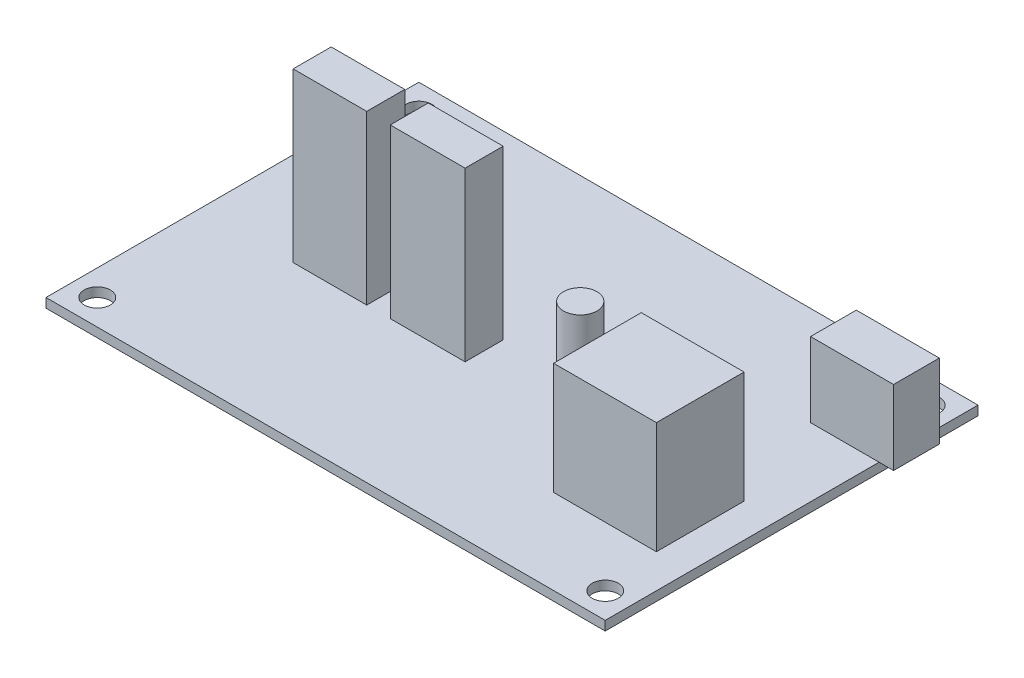
ISO-10303-21;
HEADER;
FILE_DESCRIPTION(('STEP AP214'),'2;1');
FILE_NAME('part.step','',(''),(''),'','','');
FILE_SCHEMA(('AUTOMOTIVE_DESIGN { 1 0 10303 214 1 1 1 1 }'));
ENDSEC;
DATA;
#1=APPLICATION_CONTEXT('core data for automotive mechanical design processes');
#2=APPLICATION_PROTOCOL_DEFINITION('international standard','automotive_design',2000,#1);
#3=PRODUCT_CONTEXT('',#1,'mechanical');
#4=PRODUCT('Part','Part','',(#3));
#5=PRODUCT_RELATED_PRODUCT_CATEGORY('part','',(#4));
#6=PRODUCT_DEFINITION_FORMATION('','',#4);
#7=PRODUCT_DEFINITION_CONTEXT('part definition',#1,'design');
#8=PRODUCT_DEFINITION('design','',#6,#7);
#9=PRODUCT_DEFINITION_SHAPE('','',#8);
#10=(LENGTH_UNIT() NAMED_UNIT(*) SI_UNIT(.MILLI.,.METRE.));
#11=(NAMED_UNIT(*) PLANE_ANGLE_UNIT() SI_UNIT($,.RADIAN.));
#12=(NAMED_UNIT(*) SI_UNIT($,.STERADIAN.) SOLID_ANGLE_UNIT());
#13=UNCERTAINTY_MEASURE_WITH_UNIT(LENGTH_MEASURE(1.E-05),#10,'distance_accuracy_value','');
#14=(GEOMETRIC_REPRESENTATION_CONTEXT(3) GLOBAL_UNCERTAINTY_ASSIGNED_CONTEXT((#13)) GLOBAL_UNIT_ASSIGNED_CONTEXT((#10,
#11,#12)) REPRESENTATION_CONTEXT('',''));
#15=CARTESIAN_POINT('',(0.,0.,0.));
#16=DIRECTION('',(0.,0.,1.));
#17=DIRECTION('',(1.,0.,0.));
#18=AXIS2_PLACEMENT_3D('',#15,#16,#17);
#19=CARTESIAN_POINT('',(0.,1.,0.));
#20=DIRECTION('',(0.,-1.,0.));
#21=DIRECTION('',(0.,0.,-1.));
#22=AXIS2_PLACEMENT_3D('',#19,#20,#21);
#23=PLANE('',#22);
#24=DIRECTION('',(0.,0.,1.));
#25=VECTOR('',#24,1.);
#26=CARTESIAN_POINT('',(10.0167713371704,1.,-20.580137030727));
#27=LINE('',#26,#25);
#28=CARTESIAN_POINT('',(10.0167713371704,1.,-20.580137030727));
#29=VERTEX_POINT('',#28);
#30=CARTESIAN_POINT('',(10.0167713371704,1.,-16.5015168848841));
#31=VERTEX_POINT('',#30);
#32=EDGE_CURVE('E197',#29,#31,#27,.T.);
#33=ORIENTED_EDGE('',*,*,#32,.F.);
#34=DIRECTION('',(-1.,0.,0.));
#35=VECTOR('',#34,1.);
#36=CARTESIAN_POINT('',(10.0167713371704,1.,-20.580137030727));
#37=LINE('',#36,#35);
#38=CARTESIAN_POINT('',(17.91299341658,1.,-20.580137030727));
#39=VERTEX_POINT('',#38);
#40=EDGE_CURVE('E210',#39,#29,#37,.T.);
#41=ORIENTED_EDGE('',*,*,#40,.F.);
#42=DIRECTION('',(0.,0.,-1.));
#43=VECTOR('',#42,1.);
#44=CARTESIAN_POINT('',(17.91299341658,1.,-20.580137030727));
#45=LINE('',#44,#43);
#46=CARTESIAN_POINT('',(17.91299341658,1.,-16.5015168848841));
#47=VERTEX_POINT('',#46);
#48=EDGE_CURVE('E219',#47,#39,#45,.T.);
#49=ORIENTED_EDGE('',*,*,#48,.F.);
#50=DIRECTION('',(1.,0.,0.));
#51=VECTOR('',#50,1.);
#52=CARTESIAN_POINT('',(10.0167713371704,1.,-16.5015168848841));
#53=LINE('',#52,#51);
#54=EDGE_CURVE('E200',#31,#47,#53,.T.);
#55=ORIENTED_EDGE('',*,*,#54,.F.);
#56=EDGE_LOOP('',(#33,#41,#49,#55));
#57=FACE_BOUND('',#56,.T.);
#58=DIRECTION('',(0.,0.,1.));
#59=VECTOR('',#58,1.);
#60=CARTESIAN_POINT('',(45.346373352384,1.,-9.11745080098569));
#61=LINE('',#60,#59);
#62=CARTESIAN_POINT('',(45.346373352384,1.,-18.5237104188332));
#63=VERTEX_POINT('',#62);
#64=CARTESIAN_POINT('',(45.346373352384,1.,-9.11745080098569));
#65=VERTEX_POINT('',#64);
#66=EDGE_CURVE('E273',#63,#65,#61,.T.);
#67=ORIENTED_EDGE('',*,*,#66,.F.);
#68=DIRECTION('',(-1.,0.,0.));
#69=VECTOR('',#68,1.);
#70=CARTESIAN_POINT('',(45.346373352384,1.,-18.5237104188332));
#71=LINE('',#70,#69);
#72=CARTESIAN_POINT('',(56.3756946500877,1.,-18.5237104188332));
#73=VERTEX_POINT('',#72);
#74=EDGE_CURVE('E278',#73,#63,#71,.T.);
#75=ORIENTED_EDGE('',*,*,#74,.F.);
#76=DIRECTION('',(0.,0.,-1.));
#77=VECTOR('',#76,1.);
#78=CARTESIAN_POINT('',(56.3756946500877,1.,-9.11745080098569));
#79=LINE('',#78,#77);
#80=CARTESIAN_POINT('',(56.3756946500877,1.,-9.11745080098569));
#81=VERTEX_POINT('',#80);
#82=EDGE_CURVE('E290',#81,#73,#79,.T.);
#83=ORIENTED_EDGE('',*,*,#82,.F.);
#84=DIRECTION('',(1.,0.,0.));
#85=VECTOR('',#84,1.);
#86=CARTESIAN_POINT('',(45.346373352384,1.,-9.11745080098569));
#87=LINE('',#86,#85);
#88=EDGE_CURVE('E287',#65,#81,#87,.T.);
#89=ORIENTED_EDGE('',*,*,#88,.F.);
#90=EDGE_LOOP('',(#67,#75,#83,#89));
#91=FACE_BOUND('',#90,.T.);
#92=CARTESIAN_POINT('',(2.75,1.,-2.75000000000001));
#93=DIRECTION('',(0.,1.,0.));
#94=DIRECTION('',(0.,0.,1.));
#95=AXIS2_PLACEMENT_3D('',#92,#93,#94);
#96=CIRCLE('',#95,1.4);
#97=CARTESIAN_POINT('',(2.75,1.,-1.35000000000001));
#98=VERTEX_POINT('',#97);
#99=EDGE_CURVE('E306',#98,#98,#96,.T.);
#100=ORIENTED_EDGE('',*,*,#99,.F.);
#101=EDGE_LOOP('',(#100));
#102=FACE_BOUND('',#101,.T.);
#103=CARTESIAN_POINT('',(57.25,1.,-2.75000000000001));
#104=DIRECTION('',(0.,1.,0.));
#105=DIRECTION('',(0.,0.,1.));
#106=AXIS2_PLACEMENT_3D('',#103,#104,#105);
#107=CIRCLE('',#106,1.4);
#108=CARTESIAN_POINT('',(57.25,1.,-1.35000000000001));
#109=VERTEX_POINT('',#108);
#110=EDGE_CURVE('E317',#109,#109,#107,.T.);
#111=ORIENTED_EDGE('',*,*,#110,.F.);
#112=EDGE_LOOP('',(#111));
#113=FACE_BOUND('',#112,.T.);
#114=CARTESIAN_POINT('',(57.25,1.,-37.25));
#115=DIRECTION('',(0.,1.,0.));
#116=DIRECTION('',(0.,0.,1.));
#117=AXIS2_PLACEMENT_3D('',#114,#115,#116);
#118=CIRCLE('',#117,1.4);
#119=CARTESIAN_POINT('',(57.25,1.,-35.85));
#120=VERTEX_POINT('',#119);
#121=EDGE_CURVE('E311',#120,#120,#118,.T.);
#122=ORIENTED_EDGE('',*,*,#121,.F.);
#123=EDGE_LOOP('',(#122));
#124=FACE_BOUND('',#123,.T.);
#125=CARTESIAN_POINT('',(2.75,1.,-37.25));
#126=DIRECTION('',(0.,1.,0.));
#127=DIRECTION('',(0.,0.,1.));
#128=AXIS2_PLACEMENT_3D('',#125,#126,#127);
#129=CIRCLE('',#128,1.4);
#130=CARTESIAN_POINT('',(2.75,1.,-35.85));
#131=VERTEX_POINT('',#130);
#132=EDGE_CURVE('E310',#131,#131,#129,.T.);
#133=ORIENTED_EDGE('',*,*,#132,.F.);
#134=EDGE_LOOP('',(#133));
#135=FACE_BOUND('',#134,.T.);
#136=CARTESIAN_POINT('',(41.0167064095504,1.,-16.3046792013688));
#137=DIRECTION('',(0.,-1.,0.));
#138=DIRECTION('',(0.,0.,-1.));
#139=AXIS2_PLACEMENT_3D('',#136,#137,#138);
#140=CIRCLE('',#139,1.79471379581626);
#141=CARTESIAN_POINT('',(41.0167064095504,1.,-18.0993929971851));
#142=VERTEX_POINT('',#141);
#143=EDGE_CURVE('E11',#142,#142,#140,.F.);
#144=ORIENTED_EDGE('',*,*,#143,.F.);
#145=EDGE_LOOP('',(#144));
#146=FACE_BOUND('',#145,.T.);
#147=DIRECTION('',(-1.,0.,0.));
#148=VECTOR('',#147,1.);
#149=CARTESIAN_POINT('',(61.5539774171623,1.,-34.2942300538169));
#150=LINE('',#149,#148);
#151=CARTESIAN_POINT('',(60.,1.,-34.2942300538169));
#152=VERTEX_POINT('',#151);
#153=CARTESIAN_POINT('',(52.6468308758439,1.,-34.2942300538169));
#154=VERTEX_POINT('',#153);
#155=EDGE_CURVE('E249',#152,#154,#150,.T.);
#156=ORIENTED_EDGE('',*,*,#155,.F.);
#157=DIRECTION('',(0.,0.,-1.));
#158=VECTOR('',#157,1.);
#159=CARTESIAN_POINT('',(60.,1.,0.));
#160=LINE('',#159,#158);
#161=CARTESIAN_POINT('',(60.,1.,-40.));
#162=VERTEX_POINT('',#161);
#163=EDGE_CURVE('E337',#152,#162,#160,.T.);
#164=ORIENTED_EDGE('',*,*,#163,.T.);
#165=DIRECTION('',(-1.,0.,0.));
#166=VECTOR('',#165,1.);
#167=CARTESIAN_POINT('',(0.,1.,-40.));
#168=LINE('',#167,#166);
#169=CARTESIAN_POINT('',(0.,1.,-40.));
#170=VERTEX_POINT('',#169);
#171=EDGE_CURVE('E341',#162,#170,#168,.T.);
#172=ORIENTED_EDGE('',*,*,#171,.T.);
#173=DIRECTION('',(0.,0.,1.));
#174=VECTOR('',#173,1.);
#175=CARTESIAN_POINT('',(0.,1.,0.));
#176=LINE('',#175,#174);
#177=CARTESIAN_POINT('',(0.,1.,0.));
#178=VERTEX_POINT('',#177);
#179=EDGE_CURVE('E331',#170,#178,#176,.T.);
#180=ORIENTED_EDGE('',*,*,#179,.T.);
#181=DIRECTION('',(1.,0.,0.));
#182=VECTOR('',#181,1.);
#183=CARTESIAN_POINT('',(0.,1.,0.));
#184=LINE('',#183,#182);
#185=CARTESIAN_POINT('',(60.,1.,0.));
#186=VERTEX_POINT('',#185);
#187=EDGE_CURVE('E334',#178,#186,#184,.T.);
#188=ORIENTED_EDGE('',*,*,#187,.T.);
#189=CARTESIAN_POINT('',(60.,1.,-29.385358713867));
#190=VERTEX_POINT('',#189);
#191=EDGE_CURVE('E338',#186,#190,#160,.T.);
#192=ORIENTED_EDGE('',*,*,#191,.T.);
#193=DIRECTION('',(1.,0.,0.));
#194=VECTOR('',#193,1.);
#195=CARTESIAN_POINT('',(61.5539774171623,1.,-29.385358713867));
#196=LINE('',#195,#194);
#197=CARTESIAN_POINT('',(52.6468308758439,1.,-29.385358713867));
#198=VERTEX_POINT('',#197);
#199=EDGE_CURVE('E240',#198,#190,#196,.T.);
#200=ORIENTED_EDGE('',*,*,#199,.F.);
#201=DIRECTION('',(0.,0.,1.));
#202=VECTOR('',#201,1.);
#203=CARTESIAN_POINT('',(52.6468308758439,1.,-34.2942300538169));
#204=LINE('',#203,#202);
#205=EDGE_CURVE('E253',#154,#198,#204,.T.);
#206=ORIENTED_EDGE('',*,*,#205,.F.);
#207=EDGE_LOOP('',(#156,#164,#172,#180,#188,#192,#200,#206));
#208=FACE_BOUND('',#207,.T.);
#209=DIRECTION('',(0.,0.,1.));
#210=VECTOR('',#209,1.);
#211=CARTESIAN_POINT('',(20.435832094698,1.,-20.580137030727));
#212=LINE('',#211,#210);
#213=CARTESIAN_POINT('',(20.435832094698,1.,-20.580137030727));
#214=VERTEX_POINT('',#213);
#215=CARTESIAN_POINT('',(20.435832094698,1.,-16.5015168848841));
#216=VERTEX_POINT('',#215);
#217=EDGE_CURVE('E196',#214,#216,#212,.T.);
#218=ORIENTED_EDGE('',*,*,#217,.F.);
#219=DIRECTION('',(-1.,0.,0.));
#220=VECTOR('',#219,1.);
#221=CARTESIAN_POINT('',(20.435832094698,1.,-20.580137030727));
#222=LINE('',#221,#220);
#223=CARTESIAN_POINT('',(28.4665301577007,1.,-20.580137030727));
#224=VERTEX_POINT('',#223);
#225=EDGE_CURVE('E193',#224,#214,#222,.T.);
#226=ORIENTED_EDGE('',*,*,#225,.F.);
#227=DIRECTION('',(0.,0.,-1.));
#228=VECTOR('',#227,1.);
#229=CARTESIAN_POINT('',(28.4665301577007,1.,-20.580137030727));
#230=LINE('',#229,#228);
#231=CARTESIAN_POINT('',(28.4665301577007,1.,-16.5015168848841));
#232=VERTEX_POINT('',#231);
#233=EDGE_CURVE('E53',#232,#224,#230,.T.);
#234=ORIENTED_EDGE('',*,*,#233,.F.);
#235=DIRECTION('',(1.,0.,0.));
#236=VECTOR('',#235,1.);
#237=CARTESIAN_POINT('',(20.435832094698,1.,-16.5015168848841));
#238=LINE('',#237,#236);
#239=EDGE_CURVE('E48',#216,#232,#238,.T.);
#240=ORIENTED_EDGE('',*,*,#239,.F.);
#241=EDGE_LOOP('',(#218,#226,#234,#240));
#242=FACE_BOUND('',#241,.T.);
#243=ADVANCED_FACE('F33',(#57,#91,#102,#113,#124,#135,#146,#208,#242),#23,.F.);
#244=CARTESIAN_POINT('',(0.,1.,0.));
#245=DIRECTION('',(1.,0.,0.));
#246=DIRECTION('',(0.,0.,-1.));
#247=AXIS2_PLACEMENT_3D('',#244,#245,#246);
#248=PLANE('',#247);
#249=DIRECTION('',(0.,0.,1.));
#250=VECTOR('',#249,1.);
#251=CARTESIAN_POINT('',(0.,0.,0.));
#252=LINE('',#251,#250);
#253=CARTESIAN_POINT('',(0.,0.,-40.));
#254=VERTEX_POINT('',#253);
#255=CARTESIAN_POINT('',(0.,0.,0.));
#256=VERTEX_POINT('',#255);
#257=EDGE_CURVE('E328',#254,#256,#252,.T.);
#258=ORIENTED_EDGE('',*,*,#257,.T.);
#259=DIRECTION('',(0.,-1.,0.));
#260=VECTOR('',#259,1.);
#261=CARTESIAN_POINT('',(0.,1.,0.));
#262=LINE('',#261,#260);
#263=EDGE_CURVE('E41',#178,#256,#262,.T.);
#264=ORIENTED_EDGE('',*,*,#263,.F.);
#265=ORIENTED_EDGE('',*,*,#179,.F.);
#266=DIRECTION('',(0.,-1.,0.));
#267=VECTOR('',#266,1.);
#268=CARTESIAN_POINT('',(0.,1.,-40.));
#269=LINE('',#268,#267);
#270=EDGE_CURVE('E344',#170,#254,#269,.T.);
#271=ORIENTED_EDGE('',*,*,#270,.T.);
#272=EDGE_LOOP('',(#258,#264,#265,#271));
#273=FACE_BOUND('',#272,.T.);
#274=ADVANCED_FACE('F35',(#273),#248,.F.);
#275=CARTESIAN_POINT('',(0.,1.,0.));
#276=DIRECTION('',(0.,0.,-1.));
#277=DIRECTION('',(-1.,0.,0.));
#278=AXIS2_PLACEMENT_3D('',#275,#276,#277);
#279=PLANE('',#278);
#280=DIRECTION('',(1.,0.,0.));
#281=VECTOR('',#280,1.);
#282=CARTESIAN_POINT('',(0.,0.,0.));
#283=LINE('',#282,#281);
#284=CARTESIAN_POINT('',(60.,0.,0.));
#285=VERTEX_POINT('',#284);
#286=EDGE_CURVE('E347',#256,#285,#283,.T.);
#287=ORIENTED_EDGE('',*,*,#286,.T.);
#288=DIRECTION('',(0.,-1.,0.));
#289=VECTOR('',#288,1.);
#290=CARTESIAN_POINT('',(60.,1.,0.));
#291=LINE('',#290,#289);
#292=EDGE_CURVE('E357',#186,#285,#291,.T.);
#293=ORIENTED_EDGE('',*,*,#292,.F.);
#294=ORIENTED_EDGE('',*,*,#187,.F.);
#295=ORIENTED_EDGE('',*,*,#263,.T.);
#296=EDGE_LOOP('',(#287,#293,#294,#295));
#297=FACE_BOUND('',#296,.T.);
#298=ADVANCED_FACE('F362',(#297),#279,.F.);
#299=CARTESIAN_POINT('',(60.,1.,0.));
#300=DIRECTION('',(-1.,0.,0.));
#301=DIRECTION('',(0.,0.,1.));
#302=AXIS2_PLACEMENT_3D('',#299,#300,#301);
#303=PLANE('',#302);
#304=DIRECTION('',(0.,0.,-1.));
#305=VECTOR('',#304,1.);
#306=CARTESIAN_POINT('',(60.,0.,0.));
#307=LINE('',#306,#305);
#308=CARTESIAN_POINT('',(60.,0.,-40.));
#309=VERTEX_POINT('',#308);
#310=EDGE_CURVE('E349',#285,#309,#307,.T.);
#311=ORIENTED_EDGE('',*,*,#310,.T.);
#312=DIRECTION('',(0.,-1.,0.));
#313=VECTOR('',#312,1.);
#314=CARTESIAN_POINT('',(60.,1.,-40.));
#315=LINE('',#314,#313);
#316=EDGE_CURVE('E354',#162,#309,#315,.T.);
#317=ORIENTED_EDGE('',*,*,#316,.F.);
#318=ORIENTED_EDGE('',*,*,#163,.F.);
#319=EDGE_CURVE('E342',#190,#152,#160,.T.);
#320=ORIENTED_EDGE('',*,*,#319,.F.);
#321=ORIENTED_EDGE('',*,*,#191,.F.);
#322=ORIENTED_EDGE('',*,*,#292,.T.);
#323=EDGE_LOOP('',(#311,#317,#318,#320,#321,#322));
#324=FACE_BOUND('',#323,.T.);
#325=ADVANCED_FACE('F374',(#324),#303,.F.);
#326=CARTESIAN_POINT('',(0.,1.,-40.));
#327=DIRECTION('',(0.,0.,1.));
#328=DIRECTION('',(1.,0.,0.));
#329=AXIS2_PLACEMENT_3D('',#326,#327,#328);
#330=PLANE('',#329);
#331=DIRECTION('',(-1.,0.,0.));
#332=VECTOR('',#331,1.);
#333=CARTESIAN_POINT('',(0.,0.,-40.));
#334=LINE('',#333,#332);
#335=EDGE_CURVE('E335',#309,#254,#334,.T.);
#336=ORIENTED_EDGE('',*,*,#335,.T.);
#337=ORIENTED_EDGE('',*,*,#270,.F.);
#338=ORIENTED_EDGE('',*,*,#171,.F.);
#339=ORIENTED_EDGE('',*,*,#316,.T.);
#340=EDGE_LOOP('',(#336,#337,#338,#339));
#341=FACE_BOUND('',#340,.T.);
#342=ADVANCED_FACE('F378',(#341),#330,.F.);
#343=CARTESIAN_POINT('',(0.,0.,0.));
#344=DIRECTION('',(0.,-1.,0.));
#345=DIRECTION('',(0.,0.,-1.));
#346=AXIS2_PLACEMENT_3D('',#343,#344,#345);
#347=PLANE('',#346);
#348=CARTESIAN_POINT('',(2.75,0.,-2.75000000000001));
#349=DIRECTION('',(0.,1.,0.));
#350=DIRECTION('',(0.,0.,1.));
#351=AXIS2_PLACEMENT_3D('',#348,#349,#350);
#352=CIRCLE('',#351,1.4);
#353=CARTESIAN_POINT('',(2.75,0.,-1.35000000000001));
#354=VERTEX_POINT('',#353);
#355=EDGE_CURVE('E320',#354,#354,#352,.T.);
#356=ORIENTED_EDGE('',*,*,#355,.T.);
#357=EDGE_LOOP('',(#356));
#358=FACE_BOUND('',#357,.T.);
#359=CARTESIAN_POINT('',(57.25,0.,-2.75000000000001));
#360=DIRECTION('',(0.,1.,0.));
#361=DIRECTION('',(0.,0.,1.));
#362=AXIS2_PLACEMENT_3D('',#359,#360,#361);
#363=CIRCLE('',#362,1.4);
#364=CARTESIAN_POINT('',(57.25,0.,-1.35000000000001));
#365=VERTEX_POINT('',#364);
#366=EDGE_CURVE('E314',#365,#365,#363,.T.);
#367=ORIENTED_EDGE('',*,*,#366,.T.);
#368=EDGE_LOOP('',(#367));
#369=FACE_BOUND('',#368,.T.);
#370=CARTESIAN_POINT('',(57.25,0.,-37.25));
#371=DIRECTION('',(0.,1.,0.));
#372=DIRECTION('',(0.,0.,1.));
#373=AXIS2_PLACEMENT_3D('',#370,#371,#372);
#374=CIRCLE('',#373,1.4);
#375=CARTESIAN_POINT('',(57.25,0.,-35.85));
#376=VERTEX_POINT('',#375);
#377=EDGE_CURVE('E307',#376,#376,#374,.T.);
#378=ORIENTED_EDGE('',*,*,#377,.T.);
#379=EDGE_LOOP('',(#378));
#380=FACE_BOUND('',#379,.T.);
#381=CARTESIAN_POINT('',(2.75,0.,-37.25));
#382=DIRECTION('',(0.,1.,0.));
#383=DIRECTION('',(0.,0.,1.));
#384=AXIS2_PLACEMENT_3D('',#381,#382,#383);
#385=CIRCLE('',#384,1.4);
#386=CARTESIAN_POINT('',(2.75,0.,-35.85));
#387=VERTEX_POINT('',#386);
#388=EDGE_CURVE('E325',#387,#387,#385,.T.);
#389=ORIENTED_EDGE('',*,*,#388,.T.);
#390=EDGE_LOOP('',(#389));
#391=FACE_BOUND('',#390,.T.);
#392=ORIENTED_EDGE('',*,*,#257,.F.);
#393=ORIENTED_EDGE('',*,*,#335,.F.);
#394=ORIENTED_EDGE('',*,*,#310,.F.);
#395=ORIENTED_EDGE('',*,*,#286,.F.);
#396=EDGE_LOOP('',(#392,#393,#394,#395));
#397=FACE_BOUND('',#396,.T.);
#398=ADVANCED_FACE('F370',(#358,#369,#380,#391,#397),#347,.T.);
#399=CARTESIAN_POINT('',(2.75,0.,-37.25));
#400=DIRECTION('',(0.,1.,0.));
#401=DIRECTION('',(0.,0.,1.));
#402=AXIS2_PLACEMENT_3D('',#399,#400,#401);
#403=CYLINDRICAL_SURFACE('',#402,1.4);
#404=ORIENTED_EDGE('',*,*,#388,.F.);
#405=EDGE_LOOP('',(#404));
#406=FACE_BOUND('',#405,.T.);
#407=ORIENTED_EDGE('',*,*,#132,.T.);
#408=EDGE_LOOP('',(#407));
#409=FACE_BOUND('',#408,.T.);
#410=ADVANCED_FACE('F426',(#406,#409),#403,.F.);
#411=CARTESIAN_POINT('',(57.25,0.,-37.25));
#412=DIRECTION('',(0.,1.,0.));
#413=DIRECTION('',(0.,0.,1.));
#414=AXIS2_PLACEMENT_3D('',#411,#412,#413);
#415=CYLINDRICAL_SURFACE('',#414,1.4);
#416=ORIENTED_EDGE('',*,*,#377,.F.);
#417=EDGE_LOOP('',(#416));
#418=FACE_BOUND('',#417,.T.);
#419=ORIENTED_EDGE('',*,*,#121,.T.);
#420=EDGE_LOOP('',(#419));
#421=FACE_BOUND('',#420,.T.);
#422=ADVANCED_FACE('F461',(#418,#421),#415,.F.);
#423=CARTESIAN_POINT('',(57.25,0.,-2.75000000000001));
#424=DIRECTION('',(0.,1.,0.));
#425=DIRECTION('',(0.,0.,1.));
#426=AXIS2_PLACEMENT_3D('',#423,#424,#425);
#427=CYLINDRICAL_SURFACE('',#426,1.4);
#428=ORIENTED_EDGE('',*,*,#366,.F.);
#429=EDGE_LOOP('',(#428));
#430=FACE_BOUND('',#429,.T.);
#431=ORIENTED_EDGE('',*,*,#110,.T.);
#432=EDGE_LOOP('',(#431));
#433=FACE_BOUND('',#432,.T.);
#434=ADVANCED_FACE('F468',(#430,#433),#427,.F.);
#435=CARTESIAN_POINT('',(2.75,0.,-2.75000000000001));
#436=DIRECTION('',(0.,1.,0.));
#437=DIRECTION('',(0.,0.,1.));
#438=AXIS2_PLACEMENT_3D('',#435,#436,#437);
#439=CYLINDRICAL_SURFACE('',#438,1.4);
#440=ORIENTED_EDGE('',*,*,#355,.F.);
#441=EDGE_LOOP('',(#440));
#442=FACE_BOUND('',#441,.T.);
#443=ORIENTED_EDGE('',*,*,#99,.T.);
#444=EDGE_LOOP('',(#443));
#445=FACE_BOUND('',#444,.T.);
#446=ADVANCED_FACE('F476',(#442,#445),#439,.F.);
#447=CARTESIAN_POINT('',(45.346373352384,13.,-9.11745080098569));
#448=DIRECTION('',(1.,0.,0.));
#449=DIRECTION('',(0.,0.,-1.));
#450=AXIS2_PLACEMENT_3D('',#447,#448,#449);
#451=PLANE('',#450);
#452=ORIENTED_EDGE('',*,*,#66,.T.);
#453=DIRECTION('',(0.,-1.,0.));
#454=VECTOR('',#453,1.);
#455=CARTESIAN_POINT('',(45.346373352384,13.,-9.11745080098569));
#456=LINE('',#455,#454);
#457=CARTESIAN_POINT('',(45.346373352384,13.,-9.11745080098569));
#458=VERTEX_POINT('',#457);
#459=EDGE_CURVE('E303',#458,#65,#456,.T.);
#460=ORIENTED_EDGE('',*,*,#459,.F.);
#461=DIRECTION('',(0.,0.,1.));
#462=VECTOR('',#461,1.);
#463=CARTESIAN_POINT('',(45.346373352384,13.,-9.11745080098569));
#464=LINE('',#463,#462);
#465=CARTESIAN_POINT('',(45.346373352384,13.,-18.5237104188332));
#466=VERTEX_POINT('',#465);
#467=EDGE_CURVE('E274',#466,#458,#464,.T.);
#468=ORIENTED_EDGE('',*,*,#467,.F.);
#469=DIRECTION('',(0.,-1.,0.));
#470=VECTOR('',#469,1.);
#471=CARTESIAN_POINT('',(45.346373352384,13.,-18.5237104188332));
#472=LINE('',#471,#470);
#473=EDGE_CURVE('E284',#466,#63,#472,.T.);
#474=ORIENTED_EDGE('',*,*,#473,.T.);
#475=EDGE_LOOP('',(#452,#460,#468,#474));
#476=FACE_BOUND('',#475,.T.);
#477=ADVANCED_FACE('F483',(#476),#451,.F.);
#478=CARTESIAN_POINT('',(45.346373352384,13.,-9.11745080098569));
#479=DIRECTION('',(0.,0.,-1.));
#480=DIRECTION('',(-1.,0.,0.));
#481=AXIS2_PLACEMENT_3D('',#478,#479,#480);
#482=PLANE('',#481);
#483=ORIENTED_EDGE('',*,*,#88,.T.);
#484=DIRECTION('',(0.,-1.,0.));
#485=VECTOR('',#484,1.);
#486=CARTESIAN_POINT('',(56.3756946500877,13.,-9.11745080098569));
#487=LINE('',#486,#485);
#488=CARTESIAN_POINT('',(56.3756946500877,13.,-9.11745080098569));
#489=VERTEX_POINT('',#488);
#490=EDGE_CURVE('E300',#489,#81,#487,.T.);
#491=ORIENTED_EDGE('',*,*,#490,.F.);
#492=DIRECTION('',(1.,0.,0.));
#493=VECTOR('',#492,1.);
#494=CARTESIAN_POINT('',(45.346373352384,13.,-9.11745080098569));
#495=LINE('',#494,#493);
#496=EDGE_CURVE('E277',#458,#489,#495,.T.);
#497=ORIENTED_EDGE('',*,*,#496,.F.);
#498=ORIENTED_EDGE('',*,*,#459,.T.);
#499=EDGE_LOOP('',(#483,#491,#497,#498));
#500=FACE_BOUND('',#499,.T.);
#501=ADVANCED_FACE('F497',(#500),#482,.F.);
#502=CARTESIAN_POINT('',(56.3756946500877,13.,-9.11745080098569));
#503=DIRECTION('',(-1.,0.,0.));
#504=DIRECTION('',(0.,0.,1.));
#505=AXIS2_PLACEMENT_3D('',#502,#503,#504);
#506=PLANE('',#505);
#507=ORIENTED_EDGE('',*,*,#82,.T.);
#508=DIRECTION('',(0.,-1.,0.));
#509=VECTOR('',#508,1.);
#510=CARTESIAN_POINT('',(56.3756946500877,13.,-18.5237104188332));
#511=LINE('',#510,#509);
#512=CARTESIAN_POINT('',(56.3756946500877,13.,-18.5237104188332));
#513=VERTEX_POINT('',#512);
#514=EDGE_CURVE('E297',#513,#73,#511,.T.);
#515=ORIENTED_EDGE('',*,*,#514,.F.);
#516=DIRECTION('',(0.,0.,-1.));
#517=VECTOR('',#516,1.);
#518=CARTESIAN_POINT('',(56.3756946500877,13.,-9.11745080098569));
#519=LINE('',#518,#517);
#520=EDGE_CURVE('E280',#489,#513,#519,.T.);
#521=ORIENTED_EDGE('',*,*,#520,.F.);
#522=ORIENTED_EDGE('',*,*,#490,.T.);
#523=EDGE_LOOP('',(#507,#515,#521,#522));
#524=FACE_BOUND('',#523,.T.);
#525=ADVANCED_FACE('F505',(#524),#506,.F.);
#526=CARTESIAN_POINT('',(45.346373352384,13.,-18.5237104188332));
#527=DIRECTION('',(0.,0.,1.));
#528=DIRECTION('',(1.,0.,0.));
#529=AXIS2_PLACEMENT_3D('',#526,#527,#528);
#530=PLANE('',#529);
#531=ORIENTED_EDGE('',*,*,#74,.T.);
#532=ORIENTED_EDGE('',*,*,#473,.F.);
#533=DIRECTION('',(-1.,0.,0.));
#534=VECTOR('',#533,1.);
#535=CARTESIAN_POINT('',(45.346373352384,13.,-18.5237104188332));
#536=LINE('',#535,#534);
#537=EDGE_CURVE('E282',#513,#466,#536,.T.);
#538=ORIENTED_EDGE('',*,*,#537,.F.);
#539=ORIENTED_EDGE('',*,*,#514,.T.);
#540=EDGE_LOOP('',(#531,#532,#538,#539));
#541=FACE_BOUND('',#540,.T.);
#542=ADVANCED_FACE('F513',(#541),#530,.F.);
#543=CARTESIAN_POINT('',(0.,13.,0.));
#544=DIRECTION('',(0.,-1.,0.));
#545=DIRECTION('',(0.,0.,-1.));
#546=AXIS2_PLACEMENT_3D('',#543,#544,#545);
#547=PLANE('',#546);
#548=ORIENTED_EDGE('',*,*,#467,.T.);
#549=ORIENTED_EDGE('',*,*,#496,.T.);
#550=ORIENTED_EDGE('',*,*,#520,.T.);
#551=ORIENTED_EDGE('',*,*,#537,.T.);
#552=EDGE_LOOP('',(#548,#549,#550,#551));
#553=FACE_BOUND('',#552,.T.);
#554=ADVANCED_FACE('F521',(#553),#547,.F.);
#555=CARTESIAN_POINT('',(41.0167064095504,13.,-16.3046792013688));
#556=DIRECTION('',(0.,-1.,0.));
#557=DIRECTION('',(0.,0.,-1.));
#558=AXIS2_PLACEMENT_3D('',#555,#556,#557);
#559=CYLINDRICAL_SURFACE('',#558,1.79471379581626);
#560=CARTESIAN_POINT('',(41.0167064095504,13.,-16.3046792013688));
#561=DIRECTION('',(0.,1.,0.));
#562=DIRECTION('',(0.,0.,1.));
#563=AXIS2_PLACEMENT_3D('',#560,#561,#562);
#564=CIRCLE('',#563,1.79471379581626);
#565=CARTESIAN_POINT('',(41.0167064095504,13.,-14.5099654055525));
#566=VERTEX_POINT('',#565);
#567=EDGE_CURVE('E270',#566,#566,#564,.T.);
#568=ORIENTED_EDGE('',*,*,#567,.F.);
#569=EDGE_LOOP('',(#568));
#570=FACE_BOUND('',#569,.T.);
#571=ORIENTED_EDGE('',*,*,#143,.T.);
#572=EDGE_LOOP('',(#571));
#573=FACE_BOUND('',#572,.T.);
#574=ADVANCED_FACE('F529',(#570,#573),#559,.T.);
#575=CARTESIAN_POINT('',(41.0167064095504,13.,-16.3046792013688));
#576=DIRECTION('',(0.,1.,0.));
#577=DIRECTION('',(0.,0.,1.));
#578=AXIS2_PLACEMENT_3D('',#575,#576,#577);
#579=PLANE('',#578);
#580=ORIENTED_EDGE('',*,*,#567,.T.);
#581=EDGE_LOOP('',(#580));
#582=FACE_BOUND('',#581,.T.);
#583=ADVANCED_FACE('F537',(#582),#579,.T.);
#584=CARTESIAN_POINT('',(0.,1.,0.));
#585=DIRECTION('',(0.,-1.,0.));
#586=DIRECTION('',(0.,0.,-1.));
#587=AXIS2_PLACEMENT_3D('',#584,#585,#586);
#588=PLANE('',#587);
#589=ORIENTED_EDGE('',*,*,#319,.T.);
#590=CARTESIAN_POINT('',(61.5539774171623,1.,-34.2942300538169));
#591=VERTEX_POINT('',#590);
#592=EDGE_CURVE('E250',#591,#152,#150,.T.);
#593=ORIENTED_EDGE('',*,*,#592,.F.);
#594=DIRECTION('',(0.,0.,-1.));
#595=VECTOR('',#594,1.);
#596=CARTESIAN_POINT('',(61.5539774171623,1.,-34.2942300538169));
#597=LINE('',#596,#595);
#598=CARTESIAN_POINT('',(61.5539774171623,1.,-29.385358713867));
#599=VERTEX_POINT('',#598);
#600=EDGE_CURVE('E235',#599,#591,#597,.T.);
#601=ORIENTED_EDGE('',*,*,#600,.F.);
#602=EDGE_CURVE('E256',#190,#599,#196,.T.);
#603=ORIENTED_EDGE('',*,*,#602,.F.);
#604=EDGE_LOOP('',(#589,#593,#601,#603));
#605=FACE_BOUND('',#604,.T.);
#606=ADVANCED_FACE('F385',(#605),#588,.T.);
#607=CARTESIAN_POINT('',(61.5539774171623,9.,-34.2942300538169));
#608=DIRECTION('',(-1.,0.,0.));
#609=DIRECTION('',(0.,0.,1.));
#610=AXIS2_PLACEMENT_3D('',#607,#608,#609);
#611=PLANE('',#610);
#612=ORIENTED_EDGE('',*,*,#600,.T.);
#613=DIRECTION('',(0.,-1.,0.));
#614=VECTOR('',#613,1.);
#615=CARTESIAN_POINT('',(61.5539774171623,9.,-34.2942300538169));
#616=LINE('',#615,#614);
#617=CARTESIAN_POINT('',(61.5539774171623,9.,-34.2942300538169));
#618=VERTEX_POINT('',#617);
#619=EDGE_CURVE('E267',#618,#591,#616,.T.);
#620=ORIENTED_EDGE('',*,*,#619,.F.);
#621=DIRECTION('',(0.,0.,-1.));
#622=VECTOR('',#621,1.);
#623=CARTESIAN_POINT('',(61.5539774171623,9.,-34.2942300538169));
#624=LINE('',#623,#622);
#625=CARTESIAN_POINT('',(61.5539774171623,9.,-29.385358713867));
#626=VERTEX_POINT('',#625);
#627=EDGE_CURVE('E236',#626,#618,#624,.T.);
#628=ORIENTED_EDGE('',*,*,#627,.F.);
#629=DIRECTION('',(0.,-1.,0.));
#630=VECTOR('',#629,1.);
#631=CARTESIAN_POINT('',(61.5539774171623,9.,-29.385358713867));
#632=LINE('',#631,#630);
#633=EDGE_CURVE('E246',#626,#599,#632,.T.);
#634=ORIENTED_EDGE('',*,*,#633,.T.);
#635=EDGE_LOOP('',(#612,#620,#628,#634));
#636=FACE_BOUND('',#635,.T.);
#637=ADVANCED_FACE('F393',(#636),#611,.F.);
#638=CARTESIAN_POINT('',(61.5539774171623,9.,-34.2942300538169));
#639=DIRECTION('',(0.,0.,1.));
#640=DIRECTION('',(1.,0.,0.));
#641=AXIS2_PLACEMENT_3D('',#638,#639,#640);
#642=PLANE('',#641);
#643=ORIENTED_EDGE('',*,*,#592,.T.);
#644=ORIENTED_EDGE('',*,*,#155,.T.);
#645=DIRECTION('',(0.,-1.,0.));
#646=VECTOR('',#645,1.);
#647=CARTESIAN_POINT('',(52.6468308758439,9.,-34.2942300538169));
#648=LINE('',#647,#646);
#649=CARTESIAN_POINT('',(52.6468308758439,9.,-34.2942300538169));
#650=VERTEX_POINT('',#649);
#651=EDGE_CURVE('E264',#650,#154,#648,.T.);
#652=ORIENTED_EDGE('',*,*,#651,.F.);
#653=DIRECTION('',(-1.,0.,0.));
#654=VECTOR('',#653,1.);
#655=CARTESIAN_POINT('',(61.5539774171623,9.,-34.2942300538169));
#656=LINE('',#655,#654);
#657=EDGE_CURVE('E239',#618,#650,#656,.T.);
#658=ORIENTED_EDGE('',*,*,#657,.F.);
#659=ORIENTED_EDGE('',*,*,#619,.T.);
#660=EDGE_LOOP('',(#643,#644,#652,#658,#659));
#661=FACE_BOUND('',#660,.T.);
#662=ADVANCED_FACE('F388',(#661),#642,.F.);
#663=CARTESIAN_POINT('',(52.6468308758439,9.,-34.2942300538169));
#664=DIRECTION('',(1.,0.,0.));
#665=DIRECTION('',(0.,0.,-1.));
#666=AXIS2_PLACEMENT_3D('',#663,#664,#665);
#667=PLANE('',#666);
#668=ORIENTED_EDGE('',*,*,#205,.T.);
#669=DIRECTION('',(0.,-1.,0.));
#670=VECTOR('',#669,1.);
#671=CARTESIAN_POINT('',(52.6468308758439,9.,-29.385358713867));
#672=LINE('',#671,#670);
#673=CARTESIAN_POINT('',(52.6468308758439,9.,-29.385358713867));
#674=VERTEX_POINT('',#673);
#675=EDGE_CURVE('E261',#674,#198,#672,.T.);
#676=ORIENTED_EDGE('',*,*,#675,.F.);
#677=DIRECTION('',(0.,0.,1.));
#678=VECTOR('',#677,1.);
#679=CARTESIAN_POINT('',(52.6468308758439,9.,-34.2942300538169));
#680=LINE('',#679,#678);
#681=EDGE_CURVE('E242',#650,#674,#680,.T.);
#682=ORIENTED_EDGE('',*,*,#681,.F.);
#683=ORIENTED_EDGE('',*,*,#651,.T.);
#684=EDGE_LOOP('',(#668,#676,#682,#683));
#685=FACE_BOUND('',#684,.T.);
#686=ADVANCED_FACE('F400',(#685),#667,.F.);
#687=CARTESIAN_POINT('',(61.5539774171623,9.,-29.385358713867));
#688=DIRECTION('',(0.,0.,-1.));
#689=DIRECTION('',(-1.,0.,0.));
#690=AXIS2_PLACEMENT_3D('',#687,#688,#689);
#691=PLANE('',#690);
#692=ORIENTED_EDGE('',*,*,#199,.T.);
#693=ORIENTED_EDGE('',*,*,#602,.T.);
#694=ORIENTED_EDGE('',*,*,#633,.F.);
#695=DIRECTION('',(1.,0.,0.));
#696=VECTOR('',#695,1.);
#697=CARTESIAN_POINT('',(61.5539774171623,9.,-29.385358713867));
#698=LINE('',#697,#696);
#699=EDGE_CURVE('E244',#674,#626,#698,.T.);
#700=ORIENTED_EDGE('',*,*,#699,.F.);
#701=ORIENTED_EDGE('',*,*,#675,.T.);
#702=EDGE_LOOP('',(#692,#693,#694,#700,#701));
#703=FACE_BOUND('',#702,.T.);
#704=ADVANCED_FACE('F397',(#703),#691,.F.);
#705=CARTESIAN_POINT('',(0.,9.,0.));
#706=DIRECTION('',(0.,-1.,0.));
#707=DIRECTION('',(0.,0.,-1.));
#708=AXIS2_PLACEMENT_3D('',#705,#706,#707);
#709=PLANE('',#708);
#710=ORIENTED_EDGE('',*,*,#627,.T.);
#711=ORIENTED_EDGE('',*,*,#657,.T.);
#712=ORIENTED_EDGE('',*,*,#681,.T.);
#713=ORIENTED_EDGE('',*,*,#699,.T.);
#714=EDGE_LOOP('',(#710,#711,#712,#713));
#715=FACE_BOUND('',#714,.T.);
#716=ADVANCED_FACE('F403',(#715),#709,.F.);
#717=CARTESIAN_POINT('',(10.0167713371704,19.,-20.580137030727));
#718=DIRECTION('',(1.,0.,0.));
#719=DIRECTION('',(0.,0.,-1.));
#720=AXIS2_PLACEMENT_3D('',#717,#718,#719);
#721=PLANE('',#720);
#722=ORIENTED_EDGE('',*,*,#32,.T.);
#723=DIRECTION('',(0.,-1.,0.));
#724=VECTOR('',#723,1.);
#725=CARTESIAN_POINT('',(10.0167713371704,19.,-16.5015168848841));
#726=LINE('',#725,#724);
#727=CARTESIAN_POINT('',(10.0167713371704,19.,-16.5015168848841));
#728=VERTEX_POINT('',#727);
#729=EDGE_CURVE('E232',#728,#31,#726,.T.);
#730=ORIENTED_EDGE('',*,*,#729,.F.);
#731=DIRECTION('',(0.,0.,1.));
#732=VECTOR('',#731,1.);
#733=CARTESIAN_POINT('',(10.0167713371704,19.,-20.580137030727));
#734=LINE('',#733,#732);
#735=CARTESIAN_POINT('',(10.0167713371704,19.,-20.580137030727));
#736=VERTEX_POINT('',#735);
#737=EDGE_CURVE('E206',#736,#728,#734,.T.);
#738=ORIENTED_EDGE('',*,*,#737,.F.);
#739=DIRECTION('',(0.,-1.,0.));
#740=VECTOR('',#739,1.);
#741=CARTESIAN_POINT('',(10.0167713371704,19.,-20.580137030727));
#742=LINE('',#741,#740);
#743=EDGE_CURVE('E215',#736,#29,#742,.T.);
#744=ORIENTED_EDGE('',*,*,#743,.T.);
#745=EDGE_LOOP('',(#722,#730,#738,#744));
#746=FACE_BOUND('',#745,.T.);
#747=ADVANCED_FACE('F405',(#746),#721,.F.);
#748=CARTESIAN_POINT('',(10.0167713371704,19.,-16.5015168848841));
#749=DIRECTION('',(0.,0.,-1.));
#750=DIRECTION('',(-1.,0.,0.));
#751=AXIS2_PLACEMENT_3D('',#748,#749,#750);
#752=PLANE('',#751);
#753=ORIENTED_EDGE('',*,*,#54,.T.);
#754=DIRECTION('',(0.,-1.,0.));
#755=VECTOR('',#754,1.);
#756=CARTESIAN_POINT('',(17.91299341658,19.,-16.5015168848841));
#757=LINE('',#756,#755);
#758=CARTESIAN_POINT('',(17.91299341658,19.,-16.5015168848841));
#759=VERTEX_POINT('',#758);
#760=EDGE_CURVE('E229',#759,#47,#757,.T.);
#761=ORIENTED_EDGE('',*,*,#760,.F.);
#762=DIRECTION('',(1.,0.,0.));
#763=VECTOR('',#762,1.);
#764=CARTESIAN_POINT('',(10.0167713371704,19.,-16.5015168848841));
#765=LINE('',#764,#763);
#766=EDGE_CURVE('E209',#728,#759,#765,.T.);
#767=ORIENTED_EDGE('',*,*,#766,.F.);
#768=ORIENTED_EDGE('',*,*,#729,.T.);
#769=EDGE_LOOP('',(#753,#761,#767,#768));
#770=FACE_BOUND('',#769,.T.);
#771=ADVANCED_FACE('F411',(#770),#752,.F.);
#772=CARTESIAN_POINT('',(17.91299341658,19.,-20.580137030727));
#773=DIRECTION('',(-1.,0.,0.));
#774=DIRECTION('',(0.,0.,1.));
#775=AXIS2_PLACEMENT_3D('',#772,#773,#774);
#776=PLANE('',#775);
#777=ORIENTED_EDGE('',*,*,#48,.T.);
#778=DIRECTION('',(0.,-1.,0.));
#779=VECTOR('',#778,1.);
#780=CARTESIAN_POINT('',(17.91299341658,19.,-20.580137030727));
#781=LINE('',#780,#779);
#782=CARTESIAN_POINT('',(17.91299341658,19.,-20.580137030727));
#783=VERTEX_POINT('',#782);
#784=EDGE_CURVE('E226',#783,#39,#781,.T.);
#785=ORIENTED_EDGE('',*,*,#784,.F.);
#786=DIRECTION('',(0.,0.,-1.));
#787=VECTOR('',#786,1.);
#788=CARTESIAN_POINT('',(17.91299341658,19.,-20.580137030727));
#789=LINE('',#788,#787);
#790=EDGE_CURVE('E212',#759,#783,#789,.T.);
#791=ORIENTED_EDGE('',*,*,#790,.F.);
#792=ORIENTED_EDGE('',*,*,#760,.T.);
#793=EDGE_LOOP('',(#777,#785,#791,#792));
#794=FACE_BOUND('',#793,.T.);
#795=ADVANCED_FACE('F644',(#794),#776,.F.);
#796=CARTESIAN_POINT('',(10.0167713371704,19.,-20.580137030727));
#797=DIRECTION('',(0.,0.,1.));
#798=DIRECTION('',(1.,0.,0.));
#799=AXIS2_PLACEMENT_3D('',#796,#797,#798);
#800=PLANE('',#799);
#801=ORIENTED_EDGE('',*,*,#40,.T.);
#802=ORIENTED_EDGE('',*,*,#743,.F.);
#803=DIRECTION('',(-1.,0.,0.));
#804=VECTOR('',#803,1.);
#805=CARTESIAN_POINT('',(10.0167713371704,19.,-20.580137030727));
#806=LINE('',#805,#804);
#807=EDGE_CURVE('E214',#783,#736,#806,.T.);
#808=ORIENTED_EDGE('',*,*,#807,.F.);
#809=ORIENTED_EDGE('',*,*,#784,.T.);
#810=EDGE_LOOP('',(#801,#802,#808,#809));
#811=FACE_BOUND('',#810,.T.);
#812=ADVANCED_FACE('F653',(#811),#800,.F.);
#813=CARTESIAN_POINT('',(0.,19.,0.));
#814=DIRECTION('',(0.,1.,0.));
#815=DIRECTION('',(0.,0.,1.));
#816=AXIS2_PLACEMENT_3D('',#813,#814,#815);
#817=PLANE('',#816);
#818=ORIENTED_EDGE('',*,*,#737,.T.);
#819=ORIENTED_EDGE('',*,*,#766,.T.);
#820=ORIENTED_EDGE('',*,*,#790,.T.);
#821=ORIENTED_EDGE('',*,*,#807,.T.);
#822=EDGE_LOOP('',(#818,#819,#820,#821));
#823=FACE_BOUND('',#822,.T.);
#824=ADVANCED_FACE('F662',(#823),#817,.T.);
#825=CARTESIAN_POINT('',(20.435832094698,19.,-20.580137030727));
#826=DIRECTION('',(1.,0.,0.));
#827=DIRECTION('',(0.,0.,-1.));
#828=AXIS2_PLACEMENT_3D('',#825,#826,#827);
#829=PLANE('',#828);
#830=ORIENTED_EDGE('',*,*,#217,.T.);
#831=DIRECTION('',(0.,-1.,0.));
#832=VECTOR('',#831,1.);
#833=CARTESIAN_POINT('',(20.435832094698,19.,-16.5015168848841));
#834=LINE('',#833,#832);
#835=CARTESIAN_POINT('',(20.435832094698,19.,-16.5015168848841));
#836=VERTEX_POINT('',#835);
#837=EDGE_CURVE('E177',#836,#216,#834,.T.);
#838=ORIENTED_EDGE('',*,*,#837,.F.);
#839=DIRECTION('',(0.,0.,1.));
#840=VECTOR('',#839,1.);
#841=CARTESIAN_POINT('',(20.435832094698,19.,-20.580137030727));
#842=LINE('',#841,#840);
#843=CARTESIAN_POINT('',(20.435832094698,19.,-20.580137030727));
#844=VERTEX_POINT('',#843);
#845=EDGE_CURVE('E184',#844,#836,#842,.T.);
#846=ORIENTED_EDGE('',*,*,#845,.F.);
#847=DIRECTION('',(0.,-1.,0.));
#848=VECTOR('',#847,1.);
#849=CARTESIAN_POINT('',(20.435832094698,19.,-20.580137030727));
#850=LINE('',#849,#848);
#851=EDGE_CURVE('E724',#844,#214,#850,.T.);
#852=ORIENTED_EDGE('',*,*,#851,.T.);
#853=EDGE_LOOP('',(#830,#838,#846,#852));
#854=FACE_BOUND('',#853,.T.);
#855=ADVANCED_FACE('F195',(#854),#829,.F.);
#856=CARTESIAN_POINT('',(20.435832094698,19.,-16.5015168848841));
#857=DIRECTION('',(0.,0.,-1.));
#858=DIRECTION('',(-1.,0.,0.));
#859=AXIS2_PLACEMENT_3D('',#856,#857,#858);
#860=PLANE('',#859);
#861=ORIENTED_EDGE('',*,*,#239,.T.);
#862=DIRECTION('',(0.,-1.,0.));
#863=VECTOR('',#862,1.);
#864=CARTESIAN_POINT('',(28.4665301577007,19.,-16.5015168848841));
#865=LINE('',#864,#863);
#866=CARTESIAN_POINT('',(28.4665301577007,19.,-16.5015168848841));
#867=VERTEX_POINT('',#866);
#868=EDGE_CURVE('E180',#867,#232,#865,.T.);
#869=ORIENTED_EDGE('',*,*,#868,.F.);
#870=DIRECTION('',(1.,0.,0.));
#871=VECTOR('',#870,1.);
#872=CARTESIAN_POINT('',(20.435832094698,19.,-16.5015168848841));
#873=LINE('',#872,#871);
#874=EDGE_CURVE('E173',#836,#867,#873,.T.);
#875=ORIENTED_EDGE('',*,*,#874,.F.);
#876=ORIENTED_EDGE('',*,*,#837,.T.);
#877=EDGE_LOOP('',(#861,#869,#875,#876));
#878=FACE_BOUND('',#877,.T.);
#879=ADVANCED_FACE('F175',(#878),#860,.F.);
#880=CARTESIAN_POINT('',(28.4665301577007,19.,-20.580137030727));
#881=DIRECTION('',(-1.,0.,0.));
#882=DIRECTION('',(0.,0.,1.));
#883=AXIS2_PLACEMENT_3D('',#880,#881,#882);
#884=PLANE('',#883);
#885=ORIENTED_EDGE('',*,*,#233,.T.);
#886=DIRECTION('',(0.,-1.,0.));
#887=VECTOR('',#886,1.);
#888=CARTESIAN_POINT('',(28.4665301577007,19.,-20.580137030727));
#889=LINE('',#888,#887);
#890=CARTESIAN_POINT('',(28.4665301577007,19.,-20.580137030727));
#891=VERTEX_POINT('',#890);
#892=EDGE_CURVE('E202',#891,#224,#889,.T.);
#893=ORIENTED_EDGE('',*,*,#892,.F.);
#894=DIRECTION('',(0.,0.,-1.));
#895=VECTOR('',#894,1.);
#896=CARTESIAN_POINT('',(28.4665301577007,19.,-20.580137030727));
#897=LINE('',#896,#895);
#898=EDGE_CURVE('E183',#867,#891,#897,.T.);
#899=ORIENTED_EDGE('',*,*,#898,.F.);
#900=ORIENTED_EDGE('',*,*,#868,.T.);
#901=EDGE_LOOP('',(#885,#893,#899,#900));
#902=FACE_BOUND('',#901,.T.);
#903=ADVANCED_FACE('F686',(#902),#884,.F.);
#904=CARTESIAN_POINT('',(20.435832094698,19.,-20.580137030727));
#905=DIRECTION('',(0.,0.,1.));
#906=DIRECTION('',(1.,0.,0.));
#907=AXIS2_PLACEMENT_3D('',#904,#905,#906);
#908=PLANE('',#907);
#909=ORIENTED_EDGE('',*,*,#225,.T.);
#910=ORIENTED_EDGE('',*,*,#851,.F.);
#911=DIRECTION('',(-1.,0.,0.));
#912=VECTOR('',#911,1.);
#913=CARTESIAN_POINT('',(20.435832094698,19.,-20.580137030727));
#914=LINE('',#913,#912);
#915=EDGE_CURVE('E189',#891,#844,#914,.T.);
#916=ORIENTED_EDGE('',*,*,#915,.F.);
#917=ORIENTED_EDGE('',*,*,#892,.T.);
#918=EDGE_LOOP('',(#909,#910,#916,#917));
#919=FACE_BOUND('',#918,.T.);
#920=ADVANCED_FACE('F694',(#919),#908,.F.);
#921=CARTESIAN_POINT('',(0.,19.,0.));
#922=DIRECTION('',(0.,1.,0.));
#923=DIRECTION('',(0.,0.,1.));
#924=AXIS2_PLACEMENT_3D('',#921,#922,#923);
#925=PLANE('',#924);
#926=ORIENTED_EDGE('',*,*,#845,.T.);
#927=ORIENTED_EDGE('',*,*,#874,.T.);
#928=ORIENTED_EDGE('',*,*,#898,.T.);
#929=ORIENTED_EDGE('',*,*,#915,.T.);
#930=EDGE_LOOP('',(#926,#927,#928,#929));
#931=FACE_BOUND('',#930,.T.);
#932=ADVANCED_FACE('F187',(#931),#925,.T.);
#933=CLOSED_SHELL('',(#243,#274,#298,#325,#342,#398,#410,#422,#434,#446,#477,#501,#525,#542,
#554,#574,#583,#606,#637,#662,#686,#704,#716,#747,#771,#795,#812,#824,#855,#879,#903,#920,#932));
#934=MANIFOLD_SOLID_BREP('B2',#933);
#935=ADVANCED_BREP_SHAPE_REPRESENTATION('',(#18,#934),#14);
#936=SHAPE_DEFINITION_REPRESENTATION(#9,#935);
ENDSEC;
END-ISO-10303-21;
